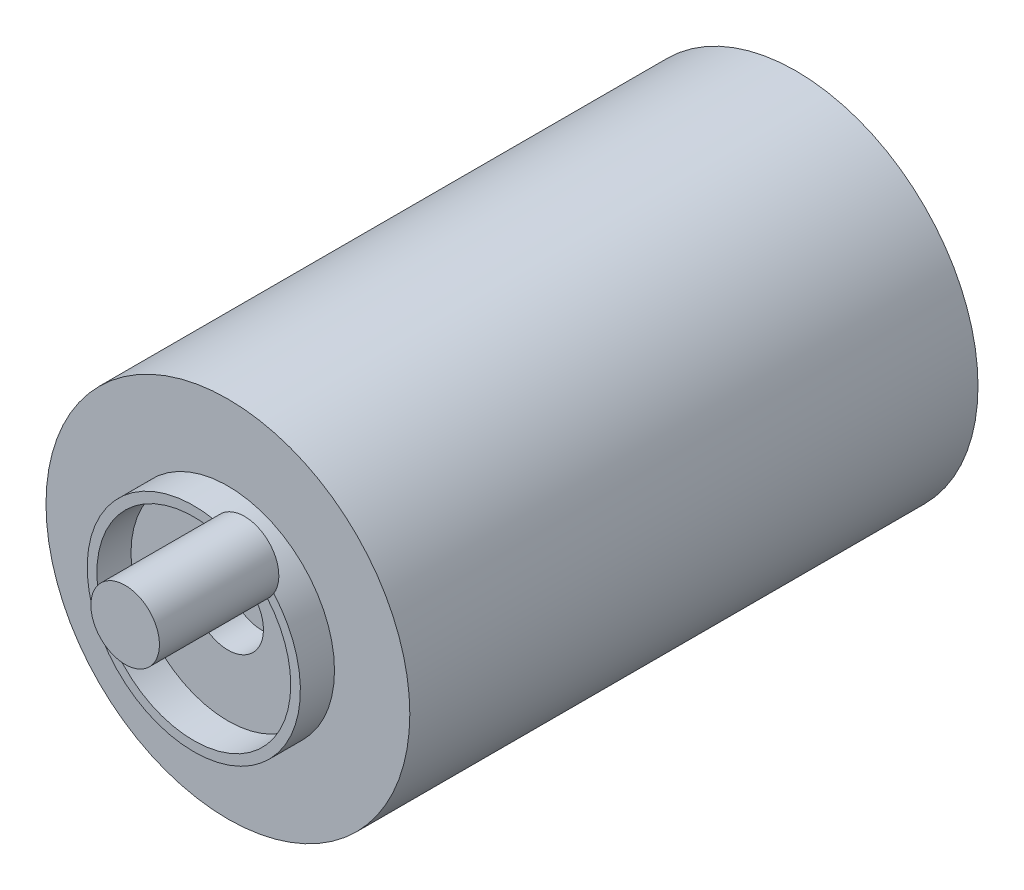
ISO-10303-21;
HEADER;
FILE_DESCRIPTION(('STEP AP214'),'2;1');
FILE_NAME('part.step','',(''),(''),'','','');
FILE_SCHEMA(('AUTOMOTIVE_DESIGN { 1 0 10303 214 1 1 1 1 }'));
ENDSEC;
DATA;
#1=APPLICATION_CONTEXT('core data for automotive mechanical design processes');
#2=APPLICATION_PROTOCOL_DEFINITION('international standard','automotive_design',2000,#1);
#3=PRODUCT_CONTEXT('',#1,'mechanical');
#4=PRODUCT('Part','Part','',(#3));
#5=PRODUCT_RELATED_PRODUCT_CATEGORY('part','',(#4));
#6=PRODUCT_DEFINITION_FORMATION('','',#4);
#7=PRODUCT_DEFINITION_CONTEXT('part definition',#1,'design');
#8=PRODUCT_DEFINITION('design','',#6,#7);
#9=PRODUCT_DEFINITION_SHAPE('','',#8);
#10=(LENGTH_UNIT() NAMED_UNIT(*) SI_UNIT(.MILLI.,.METRE.));
#11=(NAMED_UNIT(*) PLANE_ANGLE_UNIT() SI_UNIT($,.RADIAN.));
#12=(NAMED_UNIT(*) SI_UNIT($,.STERADIAN.) SOLID_ANGLE_UNIT());
#13=UNCERTAINTY_MEASURE_WITH_UNIT(LENGTH_MEASURE(1.E-05),#10,'distance_accuracy_value','');
#14=(GEOMETRIC_REPRESENTATION_CONTEXT(3) GLOBAL_UNCERTAINTY_ASSIGNED_CONTEXT((#13)) GLOBAL_UNIT_ASSIGNED_CONTEXT((#10,
#11,#12)) REPRESENTATION_CONTEXT('',''));
#15=CARTESIAN_POINT('',(0.,0.,0.));
#16=DIRECTION('',(0.,0.,1.));
#17=DIRECTION('',(1.,0.,0.));
#18=AXIS2_PLACEMENT_3D('',#15,#16,#17);
#19=CARTESIAN_POINT('',(0.,0.,-189.9));
#20=DIRECTION('',(0.,0.,1.));
#21=DIRECTION('',(1.,0.,0.));
#22=AXIS2_PLACEMENT_3D('',#19,#20,#21);
#23=CYLINDRICAL_SURFACE('',#22,64.);
#24=CARTESIAN_POINT('',(0.,0.,-189.9));
#25=DIRECTION('',(0.,0.,1.));
#26=DIRECTION('',(1.,0.,0.));
#27=AXIS2_PLACEMENT_3D('',#24,#25,#26);
#28=CIRCLE('',#27,64.);
#29=CARTESIAN_POINT('',(64.,0.,-189.9));
#30=VERTEX_POINT('',#29);
#31=EDGE_CURVE('E36',#30,#30,#28,.T.);
#32=CARTESIAN_POINT('',(0.,0.,10.));
#33=DIRECTION('',(0.,0.,1.));
#34=DIRECTION('',(1.,0.,0.));
#35=AXIS2_PLACEMENT_3D('',#32,#33,#34);
#36=CIRCLE('',#35,64.);
#37=CARTESIAN_POINT('',(64.,0.,9.99999999999998));
#38=VERTEX_POINT('',#37);
#39=EDGE_CURVE('E70',#38,#38,#36,.T.);
#40=CARTESIAN_POINT('',(64.,0.,-189.9));
#41=CARTESIAN_POINT('',(64.,0.,-187.817708333333));
#42=CARTESIAN_POINT('',(64.,0.,-185.735416666667));
#43=CARTESIAN_POINT('',(64.,0.,-181.570833333333));
#44=CARTESIAN_POINT('',(64.,0.,-179.488541666667));
#45=CARTESIAN_POINT('',(64.,0.,-175.323958333333));
#46=CARTESIAN_POINT('',(64.,0.,-173.241666666667));
#47=CARTESIAN_POINT('',(64.,0.,-169.077083333333));
#48=CARTESIAN_POINT('',(64.,0.,-166.994791666667));
#49=CARTESIAN_POINT('',(64.,0.,-162.830208333333));
#50=CARTESIAN_POINT('',(64.,0.,-160.747916666667));
#51=CARTESIAN_POINT('',(64.,0.,-156.583333333333));
#52=CARTESIAN_POINT('',(64.,0.,-154.501041666667));
#53=CARTESIAN_POINT('',(64.,0.,-150.336458333333));
#54=CARTESIAN_POINT('',(64.,0.,-148.254166666667));
#55=CARTESIAN_POINT('',(64.,0.,-144.089583333333));
#56=CARTESIAN_POINT('',(64.,0.,-142.007291666667));
#57=CARTESIAN_POINT('',(64.,0.,-137.842708333333));
#58=CARTESIAN_POINT('',(64.,0.,-135.760416666667));
#59=CARTESIAN_POINT('',(64.,0.,-131.595833333333));
#60=CARTESIAN_POINT('',(64.,0.,-129.513541666667));
#61=CARTESIAN_POINT('',(64.,0.,-125.348958333333));
#62=CARTESIAN_POINT('',(64.,0.,-123.266666666667));
#63=CARTESIAN_POINT('',(64.,0.,-119.102083333333));
#64=CARTESIAN_POINT('',(64.,0.,-117.019791666667));
#65=CARTESIAN_POINT('',(64.,0.,-112.855208333333));
#66=CARTESIAN_POINT('',(64.,0.,-110.772916666667));
#67=CARTESIAN_POINT('',(64.,0.,-106.608333333333));
#68=CARTESIAN_POINT('',(64.,0.,-104.526041666667));
#69=CARTESIAN_POINT('',(64.,0.,-100.361458333333));
#70=CARTESIAN_POINT('',(64.,0.,-98.2791666666667));
#71=CARTESIAN_POINT('',(64.,0.,-94.1145833333334));
#72=CARTESIAN_POINT('',(64.,0.,-92.0322916666667));
#73=CARTESIAN_POINT('',(64.,0.,-87.8677083333334));
#74=CARTESIAN_POINT('',(64.,0.,-85.7854166666667));
#75=CARTESIAN_POINT('',(64.,0.,-81.6208333333334));
#76=CARTESIAN_POINT('',(64.,0.,-79.5385416666667));
#77=CARTESIAN_POINT('',(64.,0.,-75.3739583333334));
#78=CARTESIAN_POINT('',(64.,0.,-73.2916666666667));
#79=CARTESIAN_POINT('',(64.,0.,-69.1270833333334));
#80=CARTESIAN_POINT('',(64.,0.,-67.0447916666667));
#81=CARTESIAN_POINT('',(64.,0.,-62.8802083333334));
#82=CARTESIAN_POINT('',(64.,0.,-60.7979166666667));
#83=CARTESIAN_POINT('',(64.,0.,-56.6333333333334));
#84=CARTESIAN_POINT('',(64.,0.,-54.5510416666667));
#85=CARTESIAN_POINT('',(64.,0.,-50.3864583333334));
#86=CARTESIAN_POINT('',(64.,0.,-48.3041666666667));
#87=CARTESIAN_POINT('',(64.,0.,-44.1395833333334));
#88=CARTESIAN_POINT('',(64.,0.,-42.0572916666667));
#89=CARTESIAN_POINT('',(64.,0.,-37.8927083333334));
#90=CARTESIAN_POINT('',(64.,0.,-35.8104166666667));
#91=CARTESIAN_POINT('',(64.,0.,-31.6458333333334));
#92=CARTESIAN_POINT('',(64.,0.,-29.5635416666667));
#93=CARTESIAN_POINT('',(64.,0.,-25.3989583333334));
#94=CARTESIAN_POINT('',(64.,0.,-23.3166666666667));
#95=CARTESIAN_POINT('',(64.,0.,-19.1520833333334));
#96=CARTESIAN_POINT('',(64.,0.,-17.0697916666667));
#97=CARTESIAN_POINT('',(64.,0.,-12.9052083333334));
#98=CARTESIAN_POINT('',(64.,0.,-10.8229166666667));
#99=CARTESIAN_POINT('',(64.,0.,-6.65833333333336));
#100=CARTESIAN_POINT('',(64.,0.,-4.57604166666669));
#101=CARTESIAN_POINT('',(64.,0.,-0.411458333333355));
#102=CARTESIAN_POINT('',(64.,0.,1.67083333333331));
#103=CARTESIAN_POINT('',(64.,0.,5.83541666666664));
#104=CARTESIAN_POINT('',(64.,0.,7.91770833333331));
#105=CARTESIAN_POINT('',(64.,0.,9.99999999999998));
#106=B_SPLINE_CURVE_WITH_KNOTS('',3,(#40,#41,#42,#43,#44,#45,#46,#47,#48,#49,#50,#51,#52,#53,
#54,#55,#56,#57,#58,#59,#60,#61,#62,#63,#64,#65,#66,#67,#68,#69,#70,#71,#72,#73,#74,#75,#76,#77,
#78,#79,#80,#81,#82,#83,#84,#85,#86,#87,#88,#89,#90,#91,#92,#93,#94,#95,#96,#97,#98,#99,#100,
#101,#102,#103,#104,#105),.UNSPECIFIED.,.F.,.F.,(4,2,2,2,2,2,2,2,2,2,2,2,2,2,2,2,2,2,2,2,2,2,2,
2,2,2,2,2,2,2,2,2,4),(0.,6.24687499999999,12.49375,18.740625,24.9875,31.234375,37.48125,
43.728125,49.975,56.221875,62.46875,68.715625,74.9625,81.209375,87.45625,93.703125,99.95,
106.196875,112.44375,118.690625,124.9375,131.184375,137.43125,143.678125,149.925,156.171875,
162.41875,168.665625,174.9125,181.159375,187.40625,193.653125,199.9),.UNSPECIFIED.);
#107=EDGE_CURVE('BSEAM33',#30,#38,#106,.T.);
#108=ORIENTED_EDGE('',*,*,#31,.T.);
#109=ORIENTED_EDGE('',*,*,#39,.F.);
#110=ORIENTED_EDGE('',*,*,#107,.T.);
#111=ORIENTED_EDGE('',*,*,#107,.F.);
#112=EDGE_LOOP('',(#108,#110,#109,#111));
#113=FACE_BOUND('',#112,.T.);
#114=ADVANCED_FACE('F33',(#113),#23,.T.);
#115=CARTESIAN_POINT('',(0.,0.,-189.9));
#116=DIRECTION('',(0.,0.,1.));
#117=DIRECTION('',(1.,0.,0.));
#118=AXIS2_PLACEMENT_3D('',#115,#116,#117);
#119=PLANE('',#118);
#120=ORIENTED_EDGE('',*,*,#31,.F.);
#121=EDGE_LOOP('',(#120));
#122=FACE_BOUND('',#121,.T.);
#123=ADVANCED_FACE('F104',(#122),#119,.F.);
#124=CARTESIAN_POINT('',(0.,0.,10.));
#125=DIRECTION('',(0.,0.,1.));
#126=DIRECTION('',(1.,0.,0.));
#127=AXIS2_PLACEMENT_3D('',#124,#125,#126);
#128=PLANE('',#127);
#129=CARTESIAN_POINT('',(0.,0.,10.));
#130=DIRECTION('',(0.,0.,1.));
#131=DIRECTION('',(1.,0.,0.));
#132=AXIS2_PLACEMENT_3D('',#129,#130,#131);
#133=CIRCLE('',#132,37.5);
#134=CARTESIAN_POINT('',(37.5,0.,10.));
#135=VERTEX_POINT('',#134);
#136=EDGE_CURVE('E41',#135,#135,#133,.T.);
#137=ORIENTED_EDGE('',*,*,#136,.F.);
#138=EDGE_LOOP('',(#137));
#139=FACE_BOUND('',#138,.T.);
#140=ORIENTED_EDGE('',*,*,#39,.T.);
#141=EDGE_LOOP('',(#140));
#142=FACE_BOUND('',#141,.T.);
#143=ADVANCED_FACE('F106',(#139,#142),#128,.T.);
#144=CARTESIAN_POINT('',(0.,0.,22.));
#145=DIRECTION('',(0.,0.,-1.));
#146=DIRECTION('',(-1.,0.,0.));
#147=AXIS2_PLACEMENT_3D('',#144,#145,#146);
#148=CYLINDRICAL_SURFACE('',#147,37.5);
#149=CARTESIAN_POINT('',(0.,0.,22.));
#150=DIRECTION('',(0.,0.,1.));
#151=DIRECTION('',(1.,0.,0.));
#152=AXIS2_PLACEMENT_3D('',#149,#150,#151);
#153=CIRCLE('',#152,37.5);
#154=CARTESIAN_POINT('',(28.1328300714932,24.795037248782,22.));
#155=VERTEX_POINT('',#154);
#156=CARTESIAN_POINT('',(7.21680197556658,36.799018590792,22.));
#157=VERTEX_POINT('',#156);
#158=EDGE_CURVE('E63',#155,#157,#153,.T.);
#159=ORIENTED_EDGE('',*,*,#158,.F.);
#160=EDGE_CURVE('E66',#157,#155,#153,.T.);
#161=ORIENTED_EDGE('',*,*,#160,.F.);
#162=EDGE_LOOP('',(#159,#161));
#163=FACE_BOUND('',#162,.T.);
#164=ORIENTED_EDGE('',*,*,#136,.T.);
#165=EDGE_LOOP('',(#164));
#166=FACE_BOUND('',#165,.T.);
#167=ADVANCED_FACE('F64',(#163,#166),#148,.T.);
#168=CARTESIAN_POINT('',(0.,0.,22.));
#169=DIRECTION('',(0.,0.,1.));
#170=DIRECTION('',(1.,0.,0.));
#171=AXIS2_PLACEMENT_3D('',#168,#169,#170);
#172=PLANE('',#171);
#173=CARTESIAN_POINT('',(17.8482685699181,31.099255841524,22.));
#174=DIRECTION('',(0.,0.,1.));
#175=DIRECTION('',(1.,0.,0.));
#176=AXIS2_PLACEMENT_3D('',#173,#174,#175);
#177=CIRCLE('',#176,12.0629754764219);
#178=CARTESIAN_POINT('',(6.03991687991272,33.5646579811157,22.));
#179=VERTEX_POINT('',#178);
#180=EDGE_CURVE('E43',#157,#179,#177,.T.);
#181=ORIENTED_EDGE('',*,*,#180,.F.);
#182=ORIENTED_EDGE('',*,*,#160,.T.);
#183=CARTESIAN_POINT('',(25.9338766478238,22.1472549838798,22.));
#184=VERTEX_POINT('',#183);
#185=EDGE_CURVE('E11',#184,#155,#177,.T.);
#186=ORIENTED_EDGE('',*,*,#185,.F.);
#187=CARTESIAN_POINT('',(0.,0.,22.));
#188=DIRECTION('',(0.,0.,1.));
#189=DIRECTION('',(1.,0.,0.));
#190=AXIS2_PLACEMENT_3D('',#187,#188,#189);
#191=CIRCLE('',#190,34.1037660868346);
#192=EDGE_CURVE('E55',#179,#184,#191,.T.);
#193=ORIENTED_EDGE('',*,*,#192,.F.);
#194=EDGE_LOOP('',(#181,#182,#186,#193));
#195=FACE_BOUND('',#194,.T.);
#196=ADVANCED_FACE('F72',(#195),#172,.T.);
#197=CARTESIAN_POINT('',(0.,0.,10.));
#198=DIRECTION('',(0.,0.,1.));
#199=DIRECTION('',(1.,0.,0.));
#200=AXIS2_PLACEMENT_3D('',#197,#198,#199);
#201=CYLINDRICAL_SURFACE('',#200,34.1037660868346);
#202=CARTESIAN_POINT('',(0.,0.,10.));
#203=DIRECTION('',(0.,0.,1.));
#204=DIRECTION('',(1.,0.,0.));
#205=AXIS2_PLACEMENT_3D('',#202,#203,#204);
#206=CIRCLE('',#205,34.1037660868346);
#207=CARTESIAN_POINT('',(34.1037660868346,0.,10.));
#208=VERTEX_POINT('',#207);
#209=EDGE_CURVE('E73',#208,#208,#206,.T.);
#210=ORIENTED_EDGE('',*,*,#209,.F.);
#211=EDGE_LOOP('',(#210));
#212=FACE_BOUND('',#211,.T.);
#213=EDGE_CURVE('E93',#184,#179,#191,.T.);
#214=ORIENTED_EDGE('',*,*,#213,.T.);
#215=ORIENTED_EDGE('',*,*,#192,.T.);
#216=EDGE_LOOP('',(#214,#215));
#217=FACE_BOUND('',#216,.T.);
#218=ADVANCED_FACE('F118',(#212,#217),#201,.F.);
#219=CARTESIAN_POINT('',(0.,0.,10.));
#220=DIRECTION('',(0.,0.,1.));
#221=DIRECTION('',(1.,0.,0.));
#222=AXIS2_PLACEMENT_3D('',#219,#220,#221);
#223=PLANE('',#222);
#224=CARTESIAN_POINT('',(0.,0.,10.));
#225=DIRECTION('',(0.,0.,1.));
#226=DIRECTION('',(1.,0.,0.));
#227=AXIS2_PLACEMENT_3D('',#224,#225,#226);
#228=CIRCLE('',#227,12.5);
#229=CARTESIAN_POINT('',(12.5,0.,10.));
#230=VERTEX_POINT('',#229);
#231=EDGE_CURVE('E88',#230,#230,#228,.T.);
#232=ORIENTED_EDGE('',*,*,#231,.F.);
#233=EDGE_LOOP('',(#232));
#234=FACE_BOUND('',#233,.T.);
#235=ORIENTED_EDGE('',*,*,#209,.T.);
#236=EDGE_LOOP('',(#235));
#237=FACE_BOUND('',#236,.T.);
#238=ADVANCED_FACE('F121',(#234,#237),#223,.T.);
#239=CARTESIAN_POINT('',(0.,0.,-2.));
#240=DIRECTION('',(0.,0.,1.));
#241=DIRECTION('',(1.,0.,0.));
#242=AXIS2_PLACEMENT_3D('',#239,#240,#241);
#243=CYLINDRICAL_SURFACE('',#242,12.5);
#244=CARTESIAN_POINT('',(0.,0.,-2.));
#245=DIRECTION('',(0.,0.,1.));
#246=DIRECTION('',(1.,0.,0.));
#247=AXIS2_PLACEMENT_3D('',#244,#245,#246);
#248=CIRCLE('',#247,12.5);
#249=CARTESIAN_POINT('',(12.5,0.,-2.));
#250=VERTEX_POINT('',#249);
#251=EDGE_CURVE('E85',#250,#250,#248,.T.);
#252=ORIENTED_EDGE('',*,*,#251,.F.);
#253=EDGE_LOOP('',(#252));
#254=FACE_BOUND('',#253,.T.);
#255=ORIENTED_EDGE('',*,*,#231,.T.);
#256=EDGE_LOOP('',(#255));
#257=FACE_BOUND('',#256,.T.);
#258=ADVANCED_FACE('F125',(#254,#257),#243,.F.);
#259=CARTESIAN_POINT('',(0.,0.,-2.));
#260=DIRECTION('',(0.,0.,1.));
#261=DIRECTION('',(1.,0.,0.));
#262=AXIS2_PLACEMENT_3D('',#259,#260,#261);
#263=PLANE('',#262);
#264=ORIENTED_EDGE('',*,*,#251,.T.);
#265=EDGE_LOOP('',(#264));
#266=FACE_BOUND('',#265,.T.);
#267=ADVANCED_FACE('F129',(#266),#263,.T.);
#268=CARTESIAN_POINT('',(17.8482685699181,31.099255841524,22.));
#269=DIRECTION('',(0.,0.,1.));
#270=DIRECTION('',(1.,0.,0.));
#271=AXIS2_PLACEMENT_3D('',#268,#269,#270);
#272=PLANE('',#271);
#273=EDGE_CURVE('E74',#155,#157,#177,.T.);
#274=ORIENTED_EDGE('',*,*,#273,.F.);
#275=ORIENTED_EDGE('',*,*,#158,.T.);
#276=EDGE_LOOP('',(#274,#275));
#277=FACE_BOUND('',#276,.T.);
#278=ADVANCED_FACE('F75',(#277),#272,.F.);
#279=CARTESIAN_POINT('',(17.8482685699181,31.099255841524,64.));
#280=DIRECTION('',(0.,0.,-1.));
#281=DIRECTION('',(-1.,0.,0.));
#282=AXIS2_PLACEMENT_3D('',#279,#280,#281);
#283=CYLINDRICAL_SURFACE('',#282,12.0629754764219);
#284=CARTESIAN_POINT('',(17.8482685699181,31.099255841524,64.));
#285=DIRECTION('',(0.,0.,1.));
#286=DIRECTION('',(1.,0.,0.));
#287=AXIS2_PLACEMENT_3D('',#284,#285,#286);
#288=CIRCLE('',#287,12.0629754764219);
#289=CARTESIAN_POINT('',(29.9112440463399,31.099255841524,64.));
#290=VERTEX_POINT('',#289);
#291=EDGE_CURVE('E82',#290,#290,#288,.T.);
#292=ORIENTED_EDGE('',*,*,#291,.F.);
#293=EDGE_LOOP('',(#292));
#294=FACE_BOUND('',#293,.T.);
#295=ORIENTED_EDGE('',*,*,#180,.T.);
#296=EDGE_CURVE('E44',#179,#184,#177,.T.);
#297=ORIENTED_EDGE('',*,*,#296,.T.);
#298=ORIENTED_EDGE('',*,*,#185,.T.);
#299=ORIENTED_EDGE('',*,*,#273,.T.);
#300=EDGE_LOOP('',(#295,#297,#298,#299));
#301=FACE_BOUND('',#300,.T.);
#302=ADVANCED_FACE('F78',(#294,#301),#283,.T.);
#303=CARTESIAN_POINT('',(17.8482685699181,31.099255841524,64.));
#304=DIRECTION('',(0.,0.,1.));
#305=DIRECTION('',(1.,0.,0.));
#306=AXIS2_PLACEMENT_3D('',#303,#304,#305);
#307=PLANE('',#306);
#308=ORIENTED_EDGE('',*,*,#291,.T.);
#309=EDGE_LOOP('',(#308));
#310=FACE_BOUND('',#309,.T.);
#311=ADVANCED_FACE('F136',(#310),#307,.T.);
#312=ORIENTED_EDGE('',*,*,#213,.F.);
#313=ORIENTED_EDGE('',*,*,#296,.F.);
#314=EDGE_LOOP('',(#312,#313));
#315=FACE_BOUND('',#314,.T.);
#316=ADVANCED_FACE('F138',(#315),#272,.F.);
#317=CLOSED_SHELL('',(#114,#123,#143,#167,#196,#218,#238,#258,#267,#278,#302,#311,#316));
#318=MANIFOLD_SOLID_BREP('B2',#317);
#319=ADVANCED_BREP_SHAPE_REPRESENTATION('',(#18,#318),#14);
#320=SHAPE_DEFINITION_REPRESENTATION(#9,#319);
ENDSEC;
END-ISO-10303-21;
